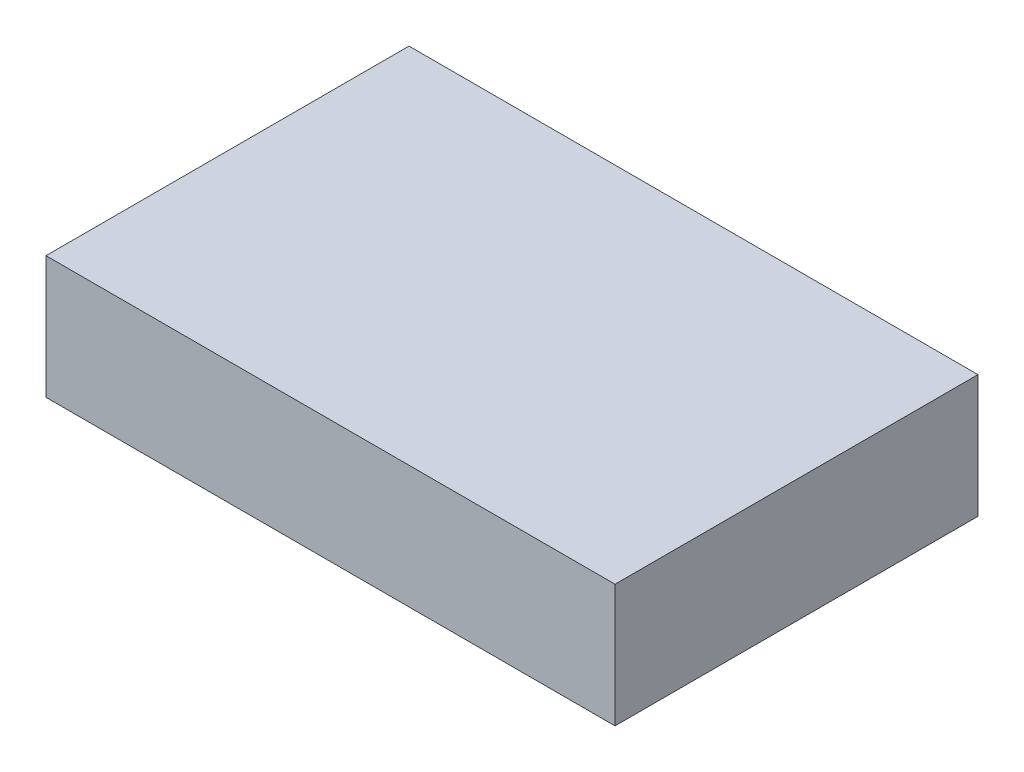
ISO-10303-21;
HEADER;
FILE_DESCRIPTION(('STEP AP214'),'2;1');
FILE_NAME('part.step','',(''),(''),'','','');
FILE_SCHEMA(('AUTOMOTIVE_DESIGN { 1 0 10303 214 1 1 1 1 }'));
ENDSEC;
DATA;
#1=APPLICATION_CONTEXT('core data for automotive mechanical design processes');
#2=APPLICATION_PROTOCOL_DEFINITION('international standard','automotive_design',2000,#1);
#3=PRODUCT_CONTEXT('',#1,'mechanical');
#4=PRODUCT('Part','Part','',(#3));
#5=PRODUCT_RELATED_PRODUCT_CATEGORY('part','',(#4));
#6=PRODUCT_DEFINITION_FORMATION('','',#4);
#7=PRODUCT_DEFINITION_CONTEXT('part definition',#1,'design');
#8=PRODUCT_DEFINITION('design','',#6,#7);
#9=PRODUCT_DEFINITION_SHAPE('','',#8);
#10=(LENGTH_UNIT() NAMED_UNIT(*) SI_UNIT(.MILLI.,.METRE.));
#11=(NAMED_UNIT(*) PLANE_ANGLE_UNIT() SI_UNIT($,.RADIAN.));
#12=(NAMED_UNIT(*) SI_UNIT($,.STERADIAN.) SOLID_ANGLE_UNIT());
#13=UNCERTAINTY_MEASURE_WITH_UNIT(LENGTH_MEASURE(1.E-05),#10,'distance_accuracy_value','');
#14=(GEOMETRIC_REPRESENTATION_CONTEXT(3) GLOBAL_UNCERTAINTY_ASSIGNED_CONTEXT((#13)) GLOBAL_UNIT_ASSIGNED_CONTEXT((#10,
#11,#12)) REPRESENTATION_CONTEXT('',''));
#15=CARTESIAN_POINT('',(0.,0.,0.));
#16=DIRECTION('',(0.,0.,1.));
#17=DIRECTION('',(1.,0.,0.));
#18=AXIS2_PLACEMENT_3D('',#15,#16,#17);
#19=CARTESIAN_POINT('',(44.05,19.,-28.1));
#20=DIRECTION('',(-1.,0.,0.));
#21=DIRECTION('',(0.,0.,1.));
#22=AXIS2_PLACEMENT_3D('',#19,#20,#21);
#23=PLANE('',#22);
#24=DIRECTION('',(0.,0.,-1.));
#25=VECTOR('',#24,1.);
#26=CARTESIAN_POINT('',(44.05,0.,-28.1));
#27=LINE('',#26,#25);
#28=CARTESIAN_POINT('',(44.05,0.,28.1));
#29=VERTEX_POINT('',#28);
#30=CARTESIAN_POINT('',(44.05,0.,-28.1));
#31=VERTEX_POINT('',#30);
#32=EDGE_CURVE('E96',#29,#31,#27,.T.);
#33=ORIENTED_EDGE('',*,*,#32,.T.);
#34=DIRECTION('',(0.,-1.,0.));
#35=VECTOR('',#34,1.);
#36=CARTESIAN_POINT('',(44.05,19.,-28.1));
#37=LINE('',#36,#35);
#38=CARTESIAN_POINT('',(44.05,19.,-28.1));
#39=VERTEX_POINT('',#38);
#40=EDGE_CURVE('E11',#39,#31,#37,.T.);
#41=ORIENTED_EDGE('',*,*,#40,.F.);
#42=DIRECTION('',(0.,0.,-1.));
#43=VECTOR('',#42,1.);
#44=CARTESIAN_POINT('',(44.05,19.,-28.1));
#45=LINE('',#44,#43);
#46=CARTESIAN_POINT('',(44.05,19.,28.1));
#47=VERTEX_POINT('',#46);
#48=EDGE_CURVE('E84',#47,#39,#45,.T.);
#49=ORIENTED_EDGE('',*,*,#48,.F.);
#50=DIRECTION('',(0.,-1.,0.));
#51=VECTOR('',#50,1.);
#52=CARTESIAN_POINT('',(44.05,19.,28.1));
#53=LINE('',#52,#51);
#54=EDGE_CURVE('E92',#47,#29,#53,.T.);
#55=ORIENTED_EDGE('',*,*,#54,.T.);
#56=EDGE_LOOP('',(#33,#41,#49,#55));
#57=FACE_BOUND('',#56,.T.);
#58=ADVANCED_FACE('F33',(#57),#23,.F.);
#59=CARTESIAN_POINT('',(-44.05,19.,-28.1));
#60=DIRECTION('',(0.,0.,1.));
#61=DIRECTION('',(1.,0.,0.));
#62=AXIS2_PLACEMENT_3D('',#59,#60,#61);
#63=PLANE('',#62);
#64=DIRECTION('',(-1.,0.,0.));
#65=VECTOR('',#64,1.);
#66=CARTESIAN_POINT('',(-44.05,0.,-28.1));
#67=LINE('',#66,#65);
#68=CARTESIAN_POINT('',(-44.05,0.,-28.1));
#69=VERTEX_POINT('',#68);
#70=EDGE_CURVE('E88',#31,#69,#67,.T.);
#71=ORIENTED_EDGE('',*,*,#70,.T.);
#72=DIRECTION('',(0.,-1.,0.));
#73=VECTOR('',#72,1.);
#74=CARTESIAN_POINT('',(-44.05,19.,-28.1));
#75=LINE('',#74,#73);
#76=CARTESIAN_POINT('',(-44.05,19.,-28.1));
#77=VERTEX_POINT('',#76);
#78=EDGE_CURVE('E41',#77,#69,#75,.T.);
#79=ORIENTED_EDGE('',*,*,#78,.F.);
#80=DIRECTION('',(-1.,0.,0.));
#81=VECTOR('',#80,1.);
#82=CARTESIAN_POINT('',(-44.05,19.,-28.1));
#83=LINE('',#82,#81);
#84=EDGE_CURVE('E79',#39,#77,#83,.T.);
#85=ORIENTED_EDGE('',*,*,#84,.F.);
#86=ORIENTED_EDGE('',*,*,#40,.T.);
#87=EDGE_LOOP('',(#71,#79,#85,#86));
#88=FACE_BOUND('',#87,.T.);
#89=ADVANCED_FACE('F87',(#88),#63,.F.);
#90=CARTESIAN_POINT('',(-44.05,19.,-28.1));
#91=DIRECTION('',(1.,0.,0.));
#92=DIRECTION('',(0.,0.,-1.));
#93=AXIS2_PLACEMENT_3D('',#90,#91,#92);
#94=PLANE('',#93);
#95=DIRECTION('',(0.,0.,1.));
#96=VECTOR('',#95,1.);
#97=CARTESIAN_POINT('',(-44.05,0.,-28.1));
#98=LINE('',#97,#96);
#99=CARTESIAN_POINT('',(-44.05,0.,28.1));
#100=VERTEX_POINT('',#99);
#101=EDGE_CURVE('E66',#69,#100,#98,.T.);
#102=ORIENTED_EDGE('',*,*,#101,.T.);
#103=DIRECTION('',(0.,-1.,0.));
#104=VECTOR('',#103,1.);
#105=CARTESIAN_POINT('',(-44.05,19.,28.1));
#106=LINE('',#105,#104);
#107=CARTESIAN_POINT('',(-44.05,19.,28.1));
#108=VERTEX_POINT('',#107);
#109=EDGE_CURVE('E89',#108,#100,#106,.T.);
#110=ORIENTED_EDGE('',*,*,#109,.F.);
#111=DIRECTION('',(0.,0.,1.));
#112=VECTOR('',#111,1.);
#113=CARTESIAN_POINT('',(-44.05,19.,-28.1));
#114=LINE('',#113,#112);
#115=EDGE_CURVE('E82',#77,#108,#114,.T.);
#116=ORIENTED_EDGE('',*,*,#115,.F.);
#117=ORIENTED_EDGE('',*,*,#78,.T.);
#118=EDGE_LOOP('',(#102,#110,#116,#117));
#119=FACE_BOUND('',#118,.T.);
#120=ADVANCED_FACE('F90',(#119),#94,.F.);
#121=CARTESIAN_POINT('',(-44.05,19.,28.1));
#122=DIRECTION('',(0.,0.,-1.));
#123=DIRECTION('',(-1.,0.,0.));
#124=AXIS2_PLACEMENT_3D('',#121,#122,#123);
#125=PLANE('',#124);
#126=DIRECTION('',(1.,0.,0.));
#127=VECTOR('',#126,1.);
#128=CARTESIAN_POINT('',(-44.05,0.,28.1));
#129=LINE('',#128,#127);
#130=EDGE_CURVE('E72',#100,#29,#129,.T.);
#131=ORIENTED_EDGE('',*,*,#130,.T.);
#132=ORIENTED_EDGE('',*,*,#54,.F.);
#133=DIRECTION('',(1.,0.,0.));
#134=VECTOR('',#133,1.);
#135=CARTESIAN_POINT('',(-44.05,19.,28.1));
#136=LINE('',#135,#134);
#137=EDGE_CURVE('E49',#108,#47,#136,.T.);
#138=ORIENTED_EDGE('',*,*,#137,.F.);
#139=ORIENTED_EDGE('',*,*,#109,.T.);
#140=EDGE_LOOP('',(#131,#132,#138,#139));
#141=FACE_BOUND('',#140,.T.);
#142=ADVANCED_FACE('F103',(#141),#125,.F.);
#143=CARTESIAN_POINT('',(0.,19.,0.));
#144=DIRECTION('',(0.,1.,0.));
#145=DIRECTION('',(0.,0.,1.));
#146=AXIS2_PLACEMENT_3D('',#143,#144,#145);
#147=PLANE('',#146);
#148=ORIENTED_EDGE('',*,*,#48,.T.);
#149=ORIENTED_EDGE('',*,*,#84,.T.);
#150=ORIENTED_EDGE('',*,*,#115,.T.);
#151=ORIENTED_EDGE('',*,*,#137,.T.);
#152=EDGE_LOOP('',(#148,#149,#150,#151));
#153=FACE_BOUND('',#152,.T.);
#154=ADVANCED_FACE('F80',(#153),#147,.T.);
#155=CARTESIAN_POINT('',(0.,0.,0.));
#156=DIRECTION('',(0.,1.,0.));
#157=DIRECTION('',(0.,0.,1.));
#158=AXIS2_PLACEMENT_3D('',#155,#156,#157);
#159=PLANE('',#158);
#160=ORIENTED_EDGE('',*,*,#32,.F.);
#161=ORIENTED_EDGE('',*,*,#130,.F.);
#162=ORIENTED_EDGE('',*,*,#101,.F.);
#163=ORIENTED_EDGE('',*,*,#70,.F.);
#164=EDGE_LOOP('',(#160,#161,#162,#163));
#165=FACE_BOUND('',#164,.T.);
#166=ADVANCED_FACE('F106',(#165),#159,.F.);
#167=CLOSED_SHELL('',(#58,#89,#120,#142,#154,#166));
#168=MANIFOLD_SOLID_BREP('B2',#167);
#169=ADVANCED_BREP_SHAPE_REPRESENTATION('',(#18,#168),#14);
#170=SHAPE_DEFINITION_REPRESENTATION(#9,#169);
ENDSEC;
END-ISO-10303-21;
